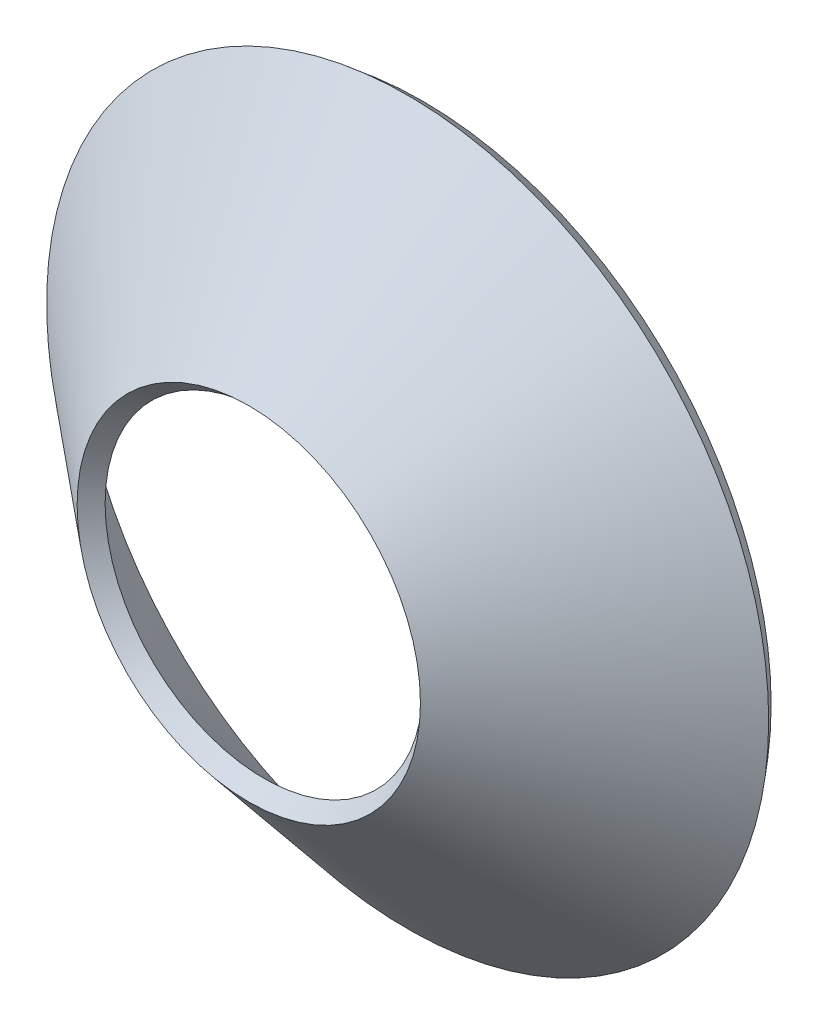
ISO-10303-21;
HEADER;
FILE_DESCRIPTION(('STEP AP214'),'2;1');
FILE_NAME('part.step','',(''),(''),'','','');
FILE_SCHEMA(('AUTOMOTIVE_DESIGN { 1 0 10303 214 1 1 1 1 }'));
ENDSEC;
DATA;
#1=APPLICATION_CONTEXT('core data for automotive mechanical design processes');
#2=APPLICATION_PROTOCOL_DEFINITION('international standard','automotive_design',2000,#1);
#3=PRODUCT_CONTEXT('',#1,'mechanical');
#4=PRODUCT('Part','Part','',(#3));
#5=PRODUCT_RELATED_PRODUCT_CATEGORY('part','',(#4));
#6=PRODUCT_DEFINITION_FORMATION('','',#4);
#7=PRODUCT_DEFINITION_CONTEXT('part definition',#1,'design');
#8=PRODUCT_DEFINITION('design','',#6,#7);
#9=PRODUCT_DEFINITION_SHAPE('','',#8);
#10=(LENGTH_UNIT() NAMED_UNIT(*) SI_UNIT(.MILLI.,.METRE.));
#11=(NAMED_UNIT(*) PLANE_ANGLE_UNIT() SI_UNIT($,.RADIAN.));
#12=(NAMED_UNIT(*) SI_UNIT($,.STERADIAN.) SOLID_ANGLE_UNIT());
#13=UNCERTAINTY_MEASURE_WITH_UNIT(LENGTH_MEASURE(1.E-05),#10,'distance_accuracy_value','');
#14=(GEOMETRIC_REPRESENTATION_CONTEXT(3) GLOBAL_UNCERTAINTY_ASSIGNED_CONTEXT((#13)) GLOBAL_UNIT_ASSIGNED_CONTEXT((#10,
#11,#12)) REPRESENTATION_CONTEXT('',''));
#15=CARTESIAN_POINT('',(0.,0.,0.));
#16=DIRECTION('',(0.,0.,1.));
#17=DIRECTION('',(1.,0.,0.));
#18=AXIS2_PLACEMENT_3D('',#15,#16,#17);
#19=CARTESIAN_POINT('',(0.,0.,25.4));
#20=DIRECTION('',(0.,0.,-1.));
#21=DIRECTION('',(-1.,0.,0.));
#22=AXIS2_PLACEMENT_3D('',#19,#20,#21);
#23=CONICAL_SURFACE('',#22,25.4,0.872664625997171);
#24=CARTESIAN_POINT('',(0.,0.,0.));
#25=DIRECTION('',(0.,0.,1.));
#26=DIRECTION('',(1.,0.,0.));
#27=AXIS2_PLACEMENT_3D('',#24,#25,#26);
#28=CIRCLE('',#27,55.6705412518933);
#29=CARTESIAN_POINT('',(55.6705412518933,0.,0.));
#30=VERTEX_POINT('',#29);
#31=EDGE_CURVE('E60',#30,#30,#28,.T.);
#32=ORIENTED_EDGE('',*,*,#31,.F.);
#33=EDGE_LOOP('',(#32));
#34=FACE_BOUND('',#33,.T.);
#35=CARTESIAN_POINT('',(0.,0.,25.4));
#36=DIRECTION('',(0.,0.,1.));
#37=DIRECTION('',(1.,0.,0.));
#38=AXIS2_PLACEMENT_3D('',#35,#36,#37);
#39=CIRCLE('',#38,25.4);
#40=CARTESIAN_POINT('',(25.4,0.,25.4));
#41=VERTEX_POINT('',#40);
#42=EDGE_CURVE('E10',#41,#41,#39,.T.);
#43=ORIENTED_EDGE('',*,*,#42,.T.);
#44=EDGE_LOOP('',(#43));
#45=FACE_BOUND('',#44,.T.);
#46=ADVANCED_FACE('F43',(#34,#45),#23,.F.);
#47=CARTESIAN_POINT('',(0.,0.,25.4));
#48=DIRECTION('',(0.,0.,1.));
#49=DIRECTION('',(1.,0.,0.));
#50=AXIS2_PLACEMENT_3D('',#47,#48,#49);
#51=CONICAL_SURFACE('',#50,25.4,0.698131700797725);
#52=CARTESIAN_POINT('',(0.,0.,27.8321911069028));
#53=DIRECTION('',(0.,0.,1.));
#54=DIRECTION('',(1.,0.,0.));
#55=AXIS2_PLACEMENT_3D('',#52,#53,#54);
#56=CIRCLE('',#55,27.4408506607547);
#57=CARTESIAN_POINT('',(27.4408506607547,0.,27.8321911069028));
#58=VERTEX_POINT('',#57);
#59=EDGE_CURVE('E50',#58,#58,#56,.T.);
#60=ORIENTED_EDGE('',*,*,#59,.T.);
#61=EDGE_LOOP('',(#60));
#62=FACE_BOUND('',#61,.T.);
#63=ORIENTED_EDGE('',*,*,#42,.F.);
#64=EDGE_LOOP('',(#63));
#65=FACE_BOUND('',#64,.T.);
#66=ADVANCED_FACE('F71',(#62,#65),#51,.F.);
#67=CARTESIAN_POINT('',(0.,0.,27.8321911069028));
#68=DIRECTION('',(0.,0.,-1.));
#69=DIRECTION('',(-1.,0.,0.));
#70=AXIS2_PLACEMENT_3D('',#67,#68,#69);
#71=CONICAL_SURFACE('',#70,27.4408506607547,0.872664625997171);
#72=CARTESIAN_POINT('',(0.,0.,2.43219110690276));
#73=DIRECTION('',(0.,0.,1.));
#74=DIRECTION('',(1.,0.,0.));
#75=AXIS2_PLACEMENT_3D('',#72,#73,#74);
#76=CIRCLE('',#75,57.711391912648);
#77=CARTESIAN_POINT('',(57.711391912648,0.,2.43219110690276));
#78=VERTEX_POINT('',#77);
#79=EDGE_CURVE('E55',#78,#78,#76,.T.);
#80=ORIENTED_EDGE('',*,*,#79,.T.);
#81=EDGE_LOOP('',(#80));
#82=FACE_BOUND('',#81,.T.);
#83=ORIENTED_EDGE('',*,*,#59,.F.);
#84=EDGE_LOOP('',(#83));
#85=FACE_BOUND('',#84,.T.);
#86=ADVANCED_FACE('F75',(#82,#85),#71,.T.);
#87=CARTESIAN_POINT('',(0.,0.,2.43219110690276));
#88=DIRECTION('',(0.,0.,1.));
#89=DIRECTION('',(1.,0.,0.));
#90=AXIS2_PLACEMENT_3D('',#87,#88,#89);
#91=CONICAL_SURFACE('',#90,57.711391912648,0.698131700797728);
#92=ORIENTED_EDGE('',*,*,#31,.T.);
#93=EDGE_LOOP('',(#92));
#94=FACE_BOUND('',#93,.T.);
#95=ORIENTED_EDGE('',*,*,#79,.F.);
#96=EDGE_LOOP('',(#95));
#97=FACE_BOUND('',#96,.T.);
#98=ADVANCED_FACE('F67',(#94,#97),#91,.T.);
#99=CLOSED_SHELL('',(#46,#66,#86,#98));
#100=MANIFOLD_SOLID_BREP('B2',#99);
#101=ADVANCED_BREP_SHAPE_REPRESENTATION('',(#18,#100),#14);
#102=SHAPE_DEFINITION_REPRESENTATION(#9,#101);
ENDSEC;
END-ISO-10303-21;
